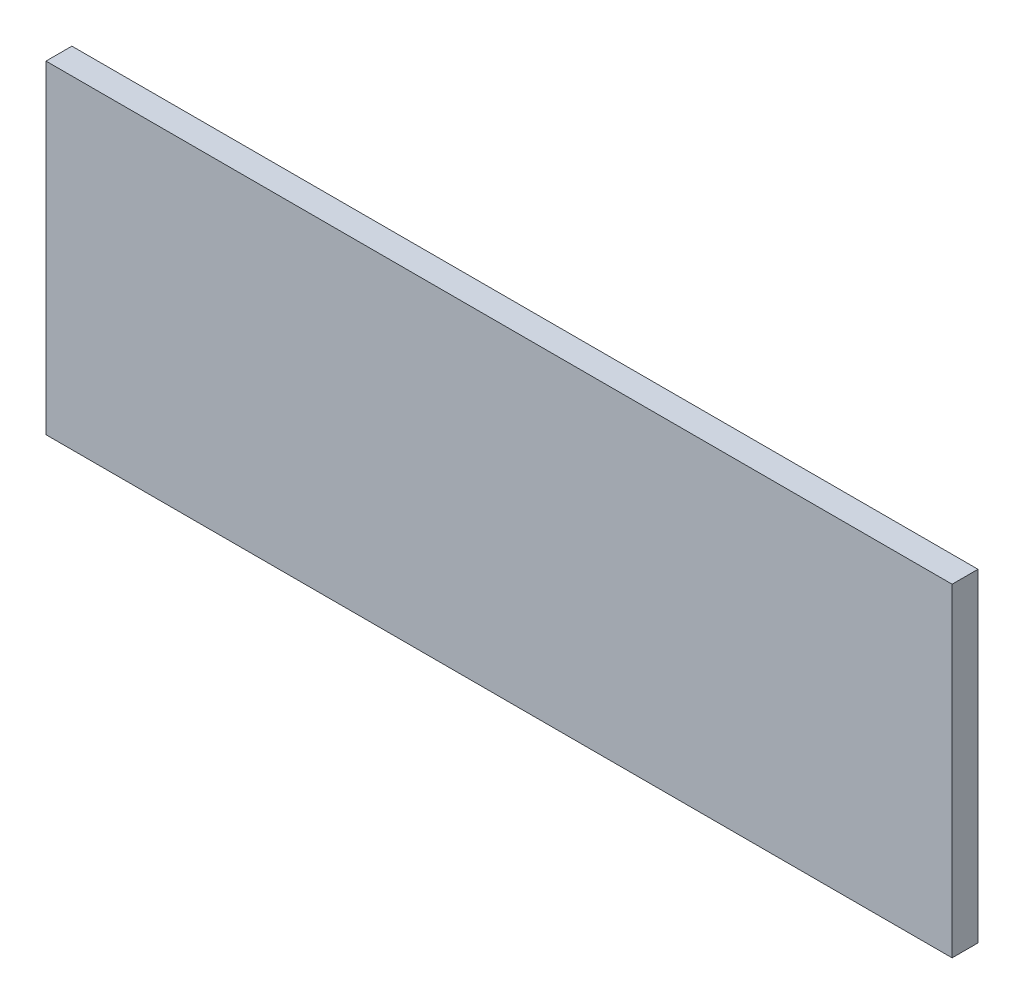
ISO-10303-21;
HEADER;
FILE_DESCRIPTION(('STEP AP214'),'2;1');
FILE_NAME('part.step','',(''),(''),'','','');
FILE_SCHEMA(('AUTOMOTIVE_DESIGN { 1 0 10303 214 1 1 1 1 }'));
ENDSEC;
DATA;
#1=APPLICATION_CONTEXT('core data for automotive mechanical design processes');
#2=APPLICATION_PROTOCOL_DEFINITION('international standard','automotive_design',2000,#1);
#3=PRODUCT_CONTEXT('',#1,'mechanical');
#4=PRODUCT('Part','Part','',(#3));
#5=PRODUCT_RELATED_PRODUCT_CATEGORY('part','',(#4));
#6=PRODUCT_DEFINITION_FORMATION('','',#4);
#7=PRODUCT_DEFINITION_CONTEXT('part definition',#1,'design');
#8=PRODUCT_DEFINITION('design','',#6,#7);
#9=PRODUCT_DEFINITION_SHAPE('','',#8);
#10=(LENGTH_UNIT() NAMED_UNIT(*) SI_UNIT(.MILLI.,.METRE.));
#11=(NAMED_UNIT(*) PLANE_ANGLE_UNIT() SI_UNIT($,.RADIAN.));
#12=(NAMED_UNIT(*) SI_UNIT($,.STERADIAN.) SOLID_ANGLE_UNIT());
#13=UNCERTAINTY_MEASURE_WITH_UNIT(LENGTH_MEASURE(1.E-05),#10,'distance_accuracy_value','');
#14=(GEOMETRIC_REPRESENTATION_CONTEXT(3) GLOBAL_UNCERTAINTY_ASSIGNED_CONTEXT((#13)) GLOBAL_UNIT_ASSIGNED_CONTEXT((#10,
#11,#12)) REPRESENTATION_CONTEXT('',''));
#15=CARTESIAN_POINT('',(0.,0.,0.));
#16=DIRECTION('',(0.,0.,1.));
#17=DIRECTION('',(1.,0.,0.));
#18=AXIS2_PLACEMENT_3D('',#15,#16,#17);
#19=CARTESIAN_POINT('',(-350.,125.,20.));
#20=DIRECTION('',(0.,0.,-1.));
#21=DIRECTION('',(-1.,0.,0.));
#22=AXIS2_PLACEMENT_3D('',#19,#20,#21);
#23=PLANE('',#22);
#24=DIRECTION('',(0.,-1.,0.));
#25=VECTOR('',#24,1.);
#26=CARTESIAN_POINT('',(-350.,-125.,20.));
#27=LINE('',#26,#25);
#28=CARTESIAN_POINT('',(-350.,125.,20.));
#29=VERTEX_POINT('',#28);
#30=CARTESIAN_POINT('',(-350.,-125.,20.));
#31=VERTEX_POINT('',#30);
#32=EDGE_CURVE('E83',#29,#31,#27,.T.);
#33=ORIENTED_EDGE('',*,*,#32,.T.);
#34=DIRECTION('',(1.,0.,0.));
#35=VECTOR('',#34,1.);
#36=CARTESIAN_POINT('',(-350.,-125.,20.));
#37=LINE('',#36,#35);
#38=CARTESIAN_POINT('',(350.,-125.,20.));
#39=VERTEX_POINT('',#38);
#40=EDGE_CURVE('E79',#31,#39,#37,.T.);
#41=ORIENTED_EDGE('',*,*,#40,.T.);
#42=DIRECTION('',(0.,1.,0.));
#43=VECTOR('',#42,1.);
#44=CARTESIAN_POINT('',(350.,-125.,20.));
#45=LINE('',#44,#43);
#46=CARTESIAN_POINT('',(350.,125.,20.));
#47=VERTEX_POINT('',#46);
#48=EDGE_CURVE('E81',#39,#47,#45,.T.);
#49=ORIENTED_EDGE('',*,*,#48,.T.);
#50=DIRECTION('',(-1.,0.,0.));
#51=VECTOR('',#50,1.);
#52=CARTESIAN_POINT('',(-350.,125.,20.));
#53=LINE('',#52,#51);
#54=EDGE_CURVE('E49',#47,#29,#53,.T.);
#55=ORIENTED_EDGE('',*,*,#54,.T.);
#56=EDGE_LOOP('',(#33,#41,#49,#55));
#57=FACE_BOUND('',#56,.T.);
#58=ADVANCED_FACE('F32',(#57),#23,.F.);
#59=CARTESIAN_POINT('',(-350.,125.,0.));
#60=DIRECTION('',(0.,0.,-1.));
#61=DIRECTION('',(-1.,0.,0.));
#62=AXIS2_PLACEMENT_3D('',#59,#60,#61);
#63=PLANE('',#62);
#64=DIRECTION('',(0.,-1.,0.));
#65=VECTOR('',#64,1.);
#66=CARTESIAN_POINT('',(-350.,-125.,0.));
#67=LINE('',#66,#65);
#68=CARTESIAN_POINT('',(-350.,125.,0.));
#69=VERTEX_POINT('',#68);
#70=CARTESIAN_POINT('',(-350.,-125.,0.));
#71=VERTEX_POINT('',#70);
#72=EDGE_CURVE('E95',#69,#71,#67,.T.);
#73=ORIENTED_EDGE('',*,*,#72,.F.);
#74=DIRECTION('',(-1.,0.,0.));
#75=VECTOR('',#74,1.);
#76=CARTESIAN_POINT('',(-350.,125.,0.));
#77=LINE('',#76,#75);
#78=CARTESIAN_POINT('',(350.,125.,0.));
#79=VERTEX_POINT('',#78);
#80=EDGE_CURVE('E72',#79,#69,#77,.T.);
#81=ORIENTED_EDGE('',*,*,#80,.F.);
#82=DIRECTION('',(0.,1.,0.));
#83=VECTOR('',#82,1.);
#84=CARTESIAN_POINT('',(350.,-125.,0.));
#85=LINE('',#84,#83);
#86=CARTESIAN_POINT('',(350.,-125.,0.));
#87=VERTEX_POINT('',#86);
#88=EDGE_CURVE('E66',#87,#79,#85,.T.);
#89=ORIENTED_EDGE('',*,*,#88,.F.);
#90=DIRECTION('',(1.,0.,0.));
#91=VECTOR('',#90,1.);
#92=CARTESIAN_POINT('',(-350.,-125.,0.));
#93=LINE('',#92,#91);
#94=EDGE_CURVE('E87',#71,#87,#93,.T.);
#95=ORIENTED_EDGE('',*,*,#94,.F.);
#96=EDGE_LOOP('',(#73,#81,#89,#95));
#97=FACE_BOUND('',#96,.T.);
#98=ADVANCED_FACE('F105',(#97),#63,.T.);
#99=CARTESIAN_POINT('',(-350.,-125.,20.));
#100=DIRECTION('',(1.,0.,0.));
#101=DIRECTION('',(0.,0.,-1.));
#102=AXIS2_PLACEMENT_3D('',#99,#100,#101);
#103=PLANE('',#102);
#104=ORIENTED_EDGE('',*,*,#72,.T.);
#105=DIRECTION('',(0.,0.,-1.));
#106=VECTOR('',#105,1.);
#107=CARTESIAN_POINT('',(-350.,-125.,20.));
#108=LINE('',#107,#106);
#109=EDGE_CURVE('E11',#31,#71,#108,.T.);
#110=ORIENTED_EDGE('',*,*,#109,.F.);
#111=ORIENTED_EDGE('',*,*,#32,.F.);
#112=DIRECTION('',(0.,0.,-1.));
#113=VECTOR('',#112,1.);
#114=CARTESIAN_POINT('',(-350.,125.,20.));
#115=LINE('',#114,#113);
#116=EDGE_CURVE('E91',#29,#69,#115,.T.);
#117=ORIENTED_EDGE('',*,*,#116,.T.);
#118=EDGE_LOOP('',(#104,#110,#111,#117));
#119=FACE_BOUND('',#118,.T.);
#120=ADVANCED_FACE('F34',(#119),#103,.F.);
#121=CARTESIAN_POINT('',(-350.,-125.,20.));
#122=DIRECTION('',(0.,1.,0.));
#123=DIRECTION('',(0.,0.,1.));
#124=AXIS2_PLACEMENT_3D('',#121,#122,#123);
#125=PLANE('',#124);
#126=ORIENTED_EDGE('',*,*,#94,.T.);
#127=DIRECTION('',(0.,0.,-1.));
#128=VECTOR('',#127,1.);
#129=CARTESIAN_POINT('',(350.,-125.,20.));
#130=LINE('',#129,#128);
#131=EDGE_CURVE('E41',#39,#87,#130,.T.);
#132=ORIENTED_EDGE('',*,*,#131,.F.);
#133=ORIENTED_EDGE('',*,*,#40,.F.);
#134=ORIENTED_EDGE('',*,*,#109,.T.);
#135=EDGE_LOOP('',(#126,#132,#133,#134));
#136=FACE_BOUND('',#135,.T.);
#137=ADVANCED_FACE('F86',(#136),#125,.F.);
#138=CARTESIAN_POINT('',(350.,-125.,20.));
#139=DIRECTION('',(-1.,0.,0.));
#140=DIRECTION('',(0.,0.,1.));
#141=AXIS2_PLACEMENT_3D('',#138,#139,#140);
#142=PLANE('',#141);
#143=ORIENTED_EDGE('',*,*,#88,.T.);
#144=DIRECTION('',(0.,0.,-1.));
#145=VECTOR('',#144,1.);
#146=CARTESIAN_POINT('',(350.,125.,20.));
#147=LINE('',#146,#145);
#148=EDGE_CURVE('E88',#47,#79,#147,.T.);
#149=ORIENTED_EDGE('',*,*,#148,.F.);
#150=ORIENTED_EDGE('',*,*,#48,.F.);
#151=ORIENTED_EDGE('',*,*,#131,.T.);
#152=EDGE_LOOP('',(#143,#149,#150,#151));
#153=FACE_BOUND('',#152,.T.);
#154=ADVANCED_FACE('F89',(#153),#142,.F.);
#155=CARTESIAN_POINT('',(-350.,125.,20.));
#156=DIRECTION('',(0.,-1.,0.));
#157=DIRECTION('',(0.,0.,-1.));
#158=AXIS2_PLACEMENT_3D('',#155,#156,#157);
#159=PLANE('',#158);
#160=ORIENTED_EDGE('',*,*,#80,.T.);
#161=ORIENTED_EDGE('',*,*,#116,.F.);
#162=ORIENTED_EDGE('',*,*,#54,.F.);
#163=ORIENTED_EDGE('',*,*,#148,.T.);
#164=EDGE_LOOP('',(#160,#161,#162,#163));
#165=FACE_BOUND('',#164,.T.);
#166=ADVANCED_FACE('F102',(#165),#159,.F.);
#167=CLOSED_SHELL('',(#58,#98,#120,#137,#154,#166));
#168=MANIFOLD_SOLID_BREP('B2',#167);
#169=ADVANCED_BREP_SHAPE_REPRESENTATION('',(#18,#168),#14);
#170=SHAPE_DEFINITION_REPRESENTATION(#9,#169);
ENDSEC;
END-ISO-10303-21;
